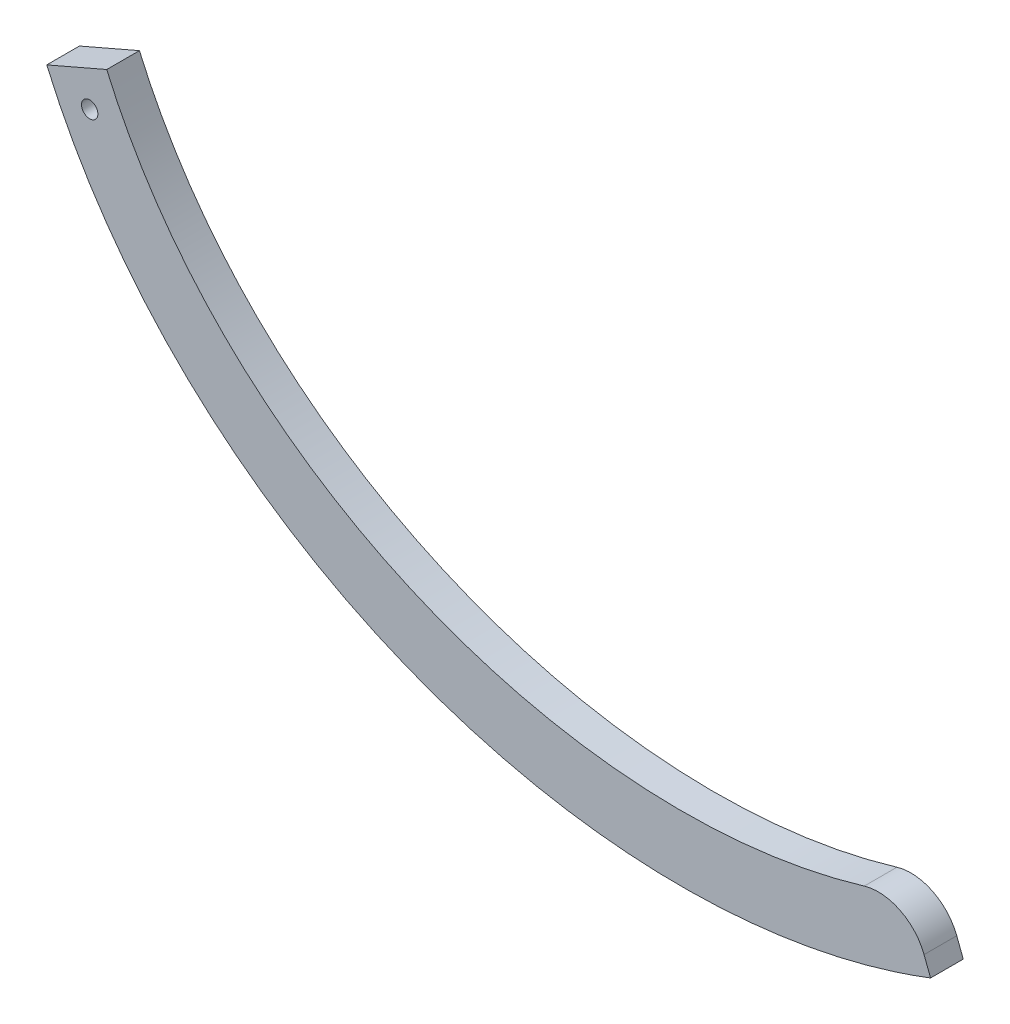
ISO-10303-21;
HEADER;
FILE_DESCRIPTION(('STEP AP214'),'2;1');
FILE_NAME('part.step','',(''),(''),'','','');
FILE_SCHEMA(('AUTOMOTIVE_DESIGN { 1 0 10303 214 1 1 1 1 }'));
ENDSEC;
DATA;
#1=APPLICATION_CONTEXT('core data for automotive mechanical design processes');
#2=APPLICATION_PROTOCOL_DEFINITION('international standard','automotive_design',2000,#1);
#3=PRODUCT_CONTEXT('',#1,'mechanical');
#4=PRODUCT('Part','Part','',(#3));
#5=PRODUCT_RELATED_PRODUCT_CATEGORY('part','',(#4));
#6=PRODUCT_DEFINITION_FORMATION('','',#4);
#7=PRODUCT_DEFINITION_CONTEXT('part definition',#1,'design');
#8=PRODUCT_DEFINITION('design','',#6,#7);
#9=PRODUCT_DEFINITION_SHAPE('','',#8);
#10=(LENGTH_UNIT() NAMED_UNIT(*) SI_UNIT(.MILLI.,.METRE.));
#11=(NAMED_UNIT(*) PLANE_ANGLE_UNIT() SI_UNIT($,.RADIAN.));
#12=(NAMED_UNIT(*) SI_UNIT($,.STERADIAN.) SOLID_ANGLE_UNIT());
#13=UNCERTAINTY_MEASURE_WITH_UNIT(LENGTH_MEASURE(1.E-05),#10,'distance_accuracy_value','');
#14=(GEOMETRIC_REPRESENTATION_CONTEXT(3) GLOBAL_UNCERTAINTY_ASSIGNED_CONTEXT((#13)) GLOBAL_UNIT_ASSIGNED_CONTEXT((#10,
#11,#12)) REPRESENTATION_CONTEXT('',''));
#15=CARTESIAN_POINT('',(0.,0.,0.));
#16=DIRECTION('',(0.,0.,1.));
#17=DIRECTION('',(1.,0.,0.));
#18=AXIS2_PLACEMENT_3D('',#15,#16,#17);
#19=CARTESIAN_POINT('',(-31.3947254035903,-23.2178168078034,10.));
#20=DIRECTION('',(0.,0.,-1.));
#21=DIRECTION('',(-1.,0.,0.));
#22=AXIS2_PLACEMENT_3D('',#19,#20,#21);
#23=PLANE('',#22);
#24=DIRECTION('',(-0.357934172965074,0.933746822122468,0.));
#25=VECTOR('',#24,1.);
#26=CARTESIAN_POINT('',(117.156813937433,-42.496857366452,10.));
#27=LINE('',#26,#25);
#28=CARTESIAN_POINT('',(117.156813937433,-42.496857366452,10.));
#29=VERTEX_POINT('',#28);
#30=CARTESIAN_POINT('',(115.163327239211,-37.2964266448216,10.));
#31=VERTEX_POINT('',#30);
#32=EDGE_CURVE('E112',#29,#31,#27,.T.);
#33=ORIENTED_EDGE('',*,*,#32,.T.);
#34=CARTESIAN_POINT('',(101.157124907374,-42.6654392392977,10.));
#35=DIRECTION('',(0.,0.,-1.));
#36=DIRECTION('',(-1.,0.,0.));
#37=AXIS2_PLACEMENT_3D('',#34,#35,#36);
#38=CIRCLE('',#37,15.);
#39=CARTESIAN_POINT('',(96.8613061648307,-28.2937329616418,10.));
#40=VERTEX_POINT('',#39);
#41=EDGE_CURVE('E11',#31,#40,#38,.F.);
#42=ORIENTED_EDGE('',*,*,#41,.T.);
#43=CARTESIAN_POINT('',(109.998130478132,-23.8219209240026,10.));
#44=CARTESIAN_POINT('',(19.6799635390519,-58.4436809355415,10.));
#45=CARTESIAN_POINT('',(-95.1127860789903,-19.5870235252169,10.));
#46=CARTESIAN_POINT('',(-134.857466087039,72.1714998438507,10.));
#47=B_SPLINE_CURVE_WITH_KNOTS('',3,(#43,#44,#45,#46),.UNSPECIFIED.,.F.,.F.,(4,4),(0.,1.),.UNSPECIFIED.);
#48=CARTESIAN_POINT('',(-134.857466087039,72.1714998438507,10.));
#49=VERTEX_POINT('',#48);
#50=EDGE_CURVE('E79',#40,#49,#47,.T.);
#51=ORIENTED_EDGE('',*,*,#50,.T.);
#52=DIRECTION('',(-0.917618901754371,-0.39746138320987,0.));
#53=VECTOR('',#52,1.);
#54=CARTESIAN_POINT('',(-153.209844122127,64.2222721796533,10.));
#55=LINE('',#54,#53);
#56=CARTESIAN_POINT('',(-153.209844122127,64.2222721796533,10.));
#57=VERTEX_POINT('',#56);
#58=EDGE_CURVE('E82',#49,#57,#55,.T.);
#59=ORIENTED_EDGE('',*,*,#58,.T.);
#60=CARTESIAN_POINT('',(-153.209844122127,64.2222721796533,10.));
#61=CARTESIAN_POINT('',(-151.826469151823,61.0284750597593,10.));
#62=CARTESIAN_POINT('',(-148.868667036327,54.6945526506738,10.));
#63=CARTESIAN_POINT('',(-142.349662300951,42.5563624431634,10.));
#64=CARTESIAN_POINT('',(-133.066091683299,28.2589997890033,10.));
#65=CARTESIAN_POINT('',(-120.314236402927,12.60246107752,10.));
#66=CARTESIAN_POINT('',(-106.129642392416,-1.52483898163761,10.));
#67=CARTESIAN_POINT('',(-90.6918293475246,-14.0905137067856,10.));
#68=CARTESIAN_POINT('',(-68.6631358287856,-28.7344659666222,10.));
#69=CARTESIAN_POINT('',(-38.8269343314737,-43.0368984979422,10.));
#70=CARTESIAN_POINT('',(-0.560107527521307,-53.6466827403225,10.));
#71=CARTESIAN_POINT('',(32.4261262704889,-56.8606379184272,10.));
#72=CARTESIAN_POINT('',(58.9038755698703,-55.916919646048,10.));
#73=CARTESIAN_POINT('',(78.6590765101118,-53.4101007868726,10.));
#74=CARTESIAN_POINT('',(94.9132820934704,-49.7838689900495,10.));
#75=CARTESIAN_POINT('',(107.704978523937,-45.9403590315722,10.));
#76=CARTESIAN_POINT('',(114.029028194061,-43.6958348373698,10.));
#77=CARTESIAN_POINT('',(117.156813937433,-42.496857366452,10.));
#78=B_SPLINE_CURVE_WITH_KNOTS('',3,(#60,#61,#62,#63,#64,#65,#66,#67,#68,#69,#70,#71,#72,#73,#74,
#75,#76,#77),.UNSPECIFIED.,.F.,.F.,(4,1,1,1,1,1,1,1,1,1,1,1,1,1,1,4),(0.,0.03125,0.0625,0.125,
0.1875,0.25,0.3125,0.375,0.5,0.625,0.75,0.8125,0.875,0.9375,0.96875,1.),.UNSPECIFIED.);
#79=EDGE_CURVE('E98',#57,#29,#78,.T.);
#80=ORIENTED_EDGE('',*,*,#79,.T.);
#81=EDGE_LOOP('',(#33,#42,#51,#59,#80));
#82=FACE_BOUND('',#81,.T.);
#83=CARTESIAN_POINT('',(-140.066359363726,59.0175272048091,10.));
#84=DIRECTION('',(0.,0.,1.));
#85=DIRECTION('',(1.,0.,0.));
#86=AXIS2_PLACEMENT_3D('',#83,#84,#85);
#87=CIRCLE('',#86,2.5);
#88=CARTESIAN_POINT('',(-137.566359363726,59.0175272048091,10.));
#89=VERTEX_POINT('',#88);
#90=EDGE_CURVE('E126',#89,#89,#87,.T.);
#91=ORIENTED_EDGE('',*,*,#90,.F.);
#92=EDGE_LOOP('',(#91));
#93=FACE_BOUND('',#92,.T.);
#94=ADVANCED_FACE('F33',(#82,#93),#23,.F.);
#95=CARTESIAN_POINT('',(-31.3947254035903,-23.2178168078034,0.));
#96=DIRECTION('',(0.,0.,-1.));
#97=DIRECTION('',(-1.,0.,0.));
#98=AXIS2_PLACEMENT_3D('',#95,#96,#97);
#99=PLANE('',#98);
#100=CARTESIAN_POINT('',(109.998130478132,-23.8219209240026,0.));
#101=CARTESIAN_POINT('',(19.6799635390519,-58.4436809355415,0.));
#102=CARTESIAN_POINT('',(-95.1127860789903,-19.5870235252169,0.));
#103=CARTESIAN_POINT('',(-134.857466087039,72.1714998438507,0.));
#104=B_SPLINE_CURVE_WITH_KNOTS('',3,(#100,#101,#102,#103),.UNSPECIFIED.,.F.,.F.,(4,4),(0.,1.),.UNSPECIFIED.);
#105=CARTESIAN_POINT('',(96.8613061648307,-28.2937329616418,0.));
#106=VERTEX_POINT('',#105);
#107=CARTESIAN_POINT('',(-134.857466087039,72.1714998438507,0.));
#108=VERTEX_POINT('',#107);
#109=EDGE_CURVE('E101',#106,#108,#104,.T.);
#110=ORIENTED_EDGE('',*,*,#109,.F.);
#111=CARTESIAN_POINT('',(101.157124907374,-42.6654392392977,0.));
#112=DIRECTION('',(0.,0.,-1.));
#113=DIRECTION('',(-1.,0.,0.));
#114=AXIS2_PLACEMENT_3D('',#111,#112,#113);
#115=CIRCLE('',#114,15.);
#116=CARTESIAN_POINT('',(115.163327239211,-37.2964266448216,0.));
#117=VERTEX_POINT('',#116);
#118=EDGE_CURVE('E55',#106,#117,#115,.T.);
#119=ORIENTED_EDGE('',*,*,#118,.T.);
#120=DIRECTION('',(-0.357934172965074,0.933746822122468,0.));
#121=VECTOR('',#120,1.);
#122=CARTESIAN_POINT('',(117.156813937433,-42.496857366452,0.));
#123=LINE('',#122,#121);
#124=CARTESIAN_POINT('',(117.156813937433,-42.496857366452,0.));
#125=VERTEX_POINT('',#124);
#126=EDGE_CURVE('E89',#125,#117,#123,.T.);
#127=ORIENTED_EDGE('',*,*,#126,.F.);
#128=CARTESIAN_POINT('',(-153.209844122127,64.2222721796533,0.));
#129=CARTESIAN_POINT('',(-151.826469151823,61.0284750597593,0.));
#130=CARTESIAN_POINT('',(-148.868667036327,54.6945526506738,0.));
#131=CARTESIAN_POINT('',(-142.349662300951,42.5563624431634,0.));
#132=CARTESIAN_POINT('',(-133.066091683299,28.2589997890033,0.));
#133=CARTESIAN_POINT('',(-120.314236402927,12.60246107752,0.));
#134=CARTESIAN_POINT('',(-106.129642392416,-1.52483898163761,0.));
#135=CARTESIAN_POINT('',(-90.6918293475246,-14.0905137067856,0.));
#136=CARTESIAN_POINT('',(-68.6631358287856,-28.7344659666222,0.));
#137=CARTESIAN_POINT('',(-38.8269343314737,-43.0368984979422,0.));
#138=CARTESIAN_POINT('',(-0.560107527521307,-53.6466827403225,0.));
#139=CARTESIAN_POINT('',(32.4261262704889,-56.8606379184272,0.));
#140=CARTESIAN_POINT('',(58.9038755698703,-55.916919646048,0.));
#141=CARTESIAN_POINT('',(78.6590765101118,-53.4101007868726,0.));
#142=CARTESIAN_POINT('',(94.9132820934704,-49.7838689900495,0.));
#143=CARTESIAN_POINT('',(107.704978523937,-45.9403590315722,0.));
#144=CARTESIAN_POINT('',(114.029028194061,-43.6958348373698,0.));
#145=CARTESIAN_POINT('',(117.156813937433,-42.496857366452,0.));
#146=B_SPLINE_CURVE_WITH_KNOTS('',3,(#128,#129,#130,#131,#132,#133,#134,#135,#136,#137,#138,
#139,#140,#141,#142,#143,#144,#145),.UNSPECIFIED.,.F.,.F.,(4,1,1,1,1,1,1,1,1,1,1,1,1,1,1,4),(0.,
0.03125,0.0625,0.125,0.1875,0.25,0.3125,0.375,0.5,0.625,0.75,0.8125,0.875,0.9375,0.96875,1.),.UNSPECIFIED.);
#147=CARTESIAN_POINT('',(-153.209844122127,64.2222721796533,0.));
#148=VERTEX_POINT('',#147);
#149=EDGE_CURVE('E114',#148,#125,#146,.T.);
#150=ORIENTED_EDGE('',*,*,#149,.F.);
#151=DIRECTION('',(-0.917618901754371,-0.39746138320987,0.));
#152=VECTOR('',#151,1.);
#153=CARTESIAN_POINT('',(-153.209844122127,64.2222721796533,0.));
#154=LINE('',#153,#152);
#155=EDGE_CURVE('E118',#108,#148,#154,.T.);
#156=ORIENTED_EDGE('',*,*,#155,.F.);
#157=EDGE_LOOP('',(#110,#119,#127,#150,#156));
#158=FACE_BOUND('',#157,.T.);
#159=CARTESIAN_POINT('',(-140.066359363726,59.0175272048091,0.));
#160=DIRECTION('',(0.,0.,1.));
#161=DIRECTION('',(1.,0.,0.));
#162=AXIS2_PLACEMENT_3D('',#159,#160,#161);
#163=CIRCLE('',#162,2.5);
#164=CARTESIAN_POINT('',(-137.566359363726,59.0175272048091,0.));
#165=VERTEX_POINT('',#164);
#166=EDGE_CURVE('E152',#165,#165,#163,.T.);
#167=ORIENTED_EDGE('',*,*,#166,.T.);
#168=EDGE_LOOP('',(#167));
#169=FACE_BOUND('',#168,.T.);
#170=ADVANCED_FACE('F147',(#158,#169),#99,.T.);
#171=DIRECTION('',(0.,0.,-1.));
#172=VECTOR('',#171,1.);
#173=SURFACE_OF_LINEAR_EXTRUSION('',#47,#172);
#174=ORIENTED_EDGE('',*,*,#50,.F.);
#175=DIRECTION('',(0.,0.,-1.));
#176=VECTOR('',#175,1.);
#177=CARTESIAN_POINT('',(96.8613061648307,-28.2937329616418,10.));
#178=LINE('',#177,#176);
#179=EDGE_CURVE('E103',#40,#106,#178,.T.);
#180=ORIENTED_EDGE('',*,*,#179,.T.);
#181=ORIENTED_EDGE('',*,*,#109,.T.);
#182=DIRECTION('',(0.,0.,-1.));
#183=VECTOR('',#182,1.);
#184=CARTESIAN_POINT('',(-134.857466087039,72.1714998438507,10.));
#185=LINE('',#184,#183);
#186=EDGE_CURVE('E94',#49,#108,#185,.T.);
#187=ORIENTED_EDGE('',*,*,#186,.F.);
#188=EDGE_LOOP('',(#174,#180,#181,#187));
#189=FACE_BOUND('',#188,.T.);
#190=ADVANCED_FACE('F100',(#189),#173,.F.);
#191=CARTESIAN_POINT('',(-153.209844122127,64.2222721796533,10.));
#192=DIRECTION('',(0.39746138320987,-0.917618901754371,0.));
#193=DIRECTION('',(0.917618901754371,0.39746138320987,0.));
#194=AXIS2_PLACEMENT_3D('',#191,#192,#193);
#195=PLANE('',#194);
#196=ORIENTED_EDGE('',*,*,#155,.T.);
#197=DIRECTION('',(0.,0.,-1.));
#198=VECTOR('',#197,1.);
#199=CARTESIAN_POINT('',(-153.209844122127,64.2222721796533,10.));
#200=LINE('',#199,#198);
#201=EDGE_CURVE('E96',#57,#148,#200,.T.);
#202=ORIENTED_EDGE('',*,*,#201,.F.);
#203=ORIENTED_EDGE('',*,*,#58,.F.);
#204=ORIENTED_EDGE('',*,*,#186,.T.);
#205=EDGE_LOOP('',(#196,#202,#203,#204));
#206=FACE_BOUND('',#205,.T.);
#207=ADVANCED_FACE('F93',(#206),#195,.F.);
#208=DIRECTION('',(0.,0.,-1.));
#209=VECTOR('',#208,1.);
#210=SURFACE_OF_LINEAR_EXTRUSION('',#78,#209);
#211=ORIENTED_EDGE('',*,*,#149,.T.);
#212=DIRECTION('',(0.,0.,-1.));
#213=VECTOR('',#212,1.);
#214=CARTESIAN_POINT('',(117.156813937433,-42.496857366452,10.));
#215=LINE('',#214,#213);
#216=EDGE_CURVE('E106',#29,#125,#215,.T.);
#217=ORIENTED_EDGE('',*,*,#216,.F.);
#218=ORIENTED_EDGE('',*,*,#79,.F.);
#219=ORIENTED_EDGE('',*,*,#201,.T.);
#220=EDGE_LOOP('',(#211,#217,#218,#219));
#221=FACE_BOUND('',#220,.T.);
#222=ADVANCED_FACE('F138',(#221),#210,.F.);
#223=CARTESIAN_POINT('',(117.156813937433,-42.496857366452,10.));
#224=DIRECTION('',(-0.933746822122468,-0.357934172965074,0.));
#225=DIRECTION('',(0.357934172965074,-0.933746822122468,0.));
#226=AXIS2_PLACEMENT_3D('',#223,#224,#225);
#227=PLANE('',#226);
#228=ORIENTED_EDGE('',*,*,#126,.T.);
#229=DIRECTION('',(0.,0.,-1.));
#230=VECTOR('',#229,1.);
#231=CARTESIAN_POINT('',(115.163327239211,-37.2964266448216,10.));
#232=LINE('',#231,#230);
#233=EDGE_CURVE('E41',#117,#31,#232,.F.);
#234=ORIENTED_EDGE('',*,*,#233,.T.);
#235=ORIENTED_EDGE('',*,*,#32,.F.);
#236=ORIENTED_EDGE('',*,*,#216,.T.);
#237=EDGE_LOOP('',(#228,#234,#235,#236));
#238=FACE_BOUND('',#237,.T.);
#239=ADVANCED_FACE('F142',(#238),#227,.F.);
#240=CARTESIAN_POINT('',(-140.066359363726,59.0175272048091,10.));
#241=DIRECTION('',(0.,0.,-1.));
#242=DIRECTION('',(-1.,0.,0.));
#243=AXIS2_PLACEMENT_3D('',#240,#241,#242);
#244=CYLINDRICAL_SURFACE('',#243,2.5);
#245=ORIENTED_EDGE('',*,*,#90,.T.);
#246=EDGE_LOOP('',(#245));
#247=FACE_BOUND('',#246,.T.);
#248=ORIENTED_EDGE('',*,*,#166,.F.);
#249=EDGE_LOOP('',(#248));
#250=FACE_BOUND('',#249,.T.);
#251=ADVANCED_FACE('F161',(#247,#250),#244,.F.);
#252=CARTESIAN_POINT('',(101.157124907374,-42.6654392392977,5.));
#253=DIRECTION('',(0.,0.,-1.));
#254=DIRECTION('',(-1.,0.,0.));
#255=AXIS2_PLACEMENT_3D('',#252,#253,#254);
#256=CYLINDRICAL_SURFACE('',#255,15.);
#257=ORIENTED_EDGE('',*,*,#41,.F.);
#258=ORIENTED_EDGE('',*,*,#233,.F.);
#259=ORIENTED_EDGE('',*,*,#118,.F.);
#260=ORIENTED_EDGE('',*,*,#179,.F.);
#261=EDGE_LOOP('',(#257,#258,#259,#260));
#262=FACE_BOUND('',#261,.T.);
#263=ADVANCED_FACE('F35',(#262),#256,.T.);
#264=CLOSED_SHELL('',(#94,#170,#190,#207,#222,#239,#251,#263));
#265=MANIFOLD_SOLID_BREP('B2',#264);
#266=ADVANCED_BREP_SHAPE_REPRESENTATION('',(#18,#265),#14);
#267=SHAPE_DEFINITION_REPRESENTATION(#9,#266);
ENDSEC;
END-ISO-10303-21;
